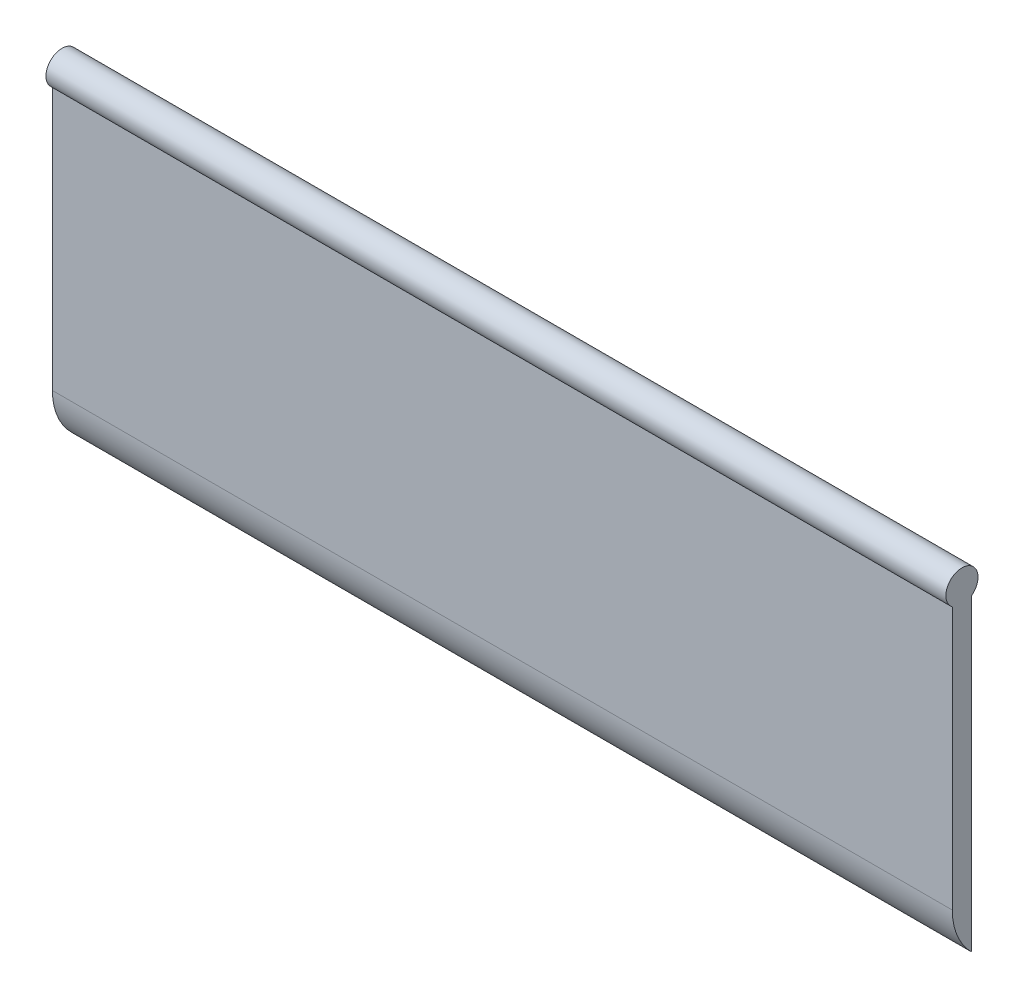
ISO-10303-21;
HEADER;
FILE_DESCRIPTION(('STEP AP214'),'2;1');
FILE_NAME('part.step','',(''),(''),'','','');
FILE_SCHEMA(('AUTOMOTIVE_DESIGN { 1 0 10303 214 1 1 1 1 }'));
ENDSEC;
DATA;
#1=APPLICATION_CONTEXT('core data for automotive mechanical design processes');
#2=APPLICATION_PROTOCOL_DEFINITION('international standard','automotive_design',2000,#1);
#3=PRODUCT_CONTEXT('',#1,'mechanical');
#4=PRODUCT('Part','Part','',(#3));
#5=PRODUCT_RELATED_PRODUCT_CATEGORY('part','',(#4));
#6=PRODUCT_DEFINITION_FORMATION('','',#4);
#7=PRODUCT_DEFINITION_CONTEXT('part definition',#1,'design');
#8=PRODUCT_DEFINITION('design','',#6,#7);
#9=PRODUCT_DEFINITION_SHAPE('','',#8);
#10=(LENGTH_UNIT() NAMED_UNIT(*) SI_UNIT(.MILLI.,.METRE.));
#11=(NAMED_UNIT(*) PLANE_ANGLE_UNIT() SI_UNIT($,.RADIAN.));
#12=(NAMED_UNIT(*) SI_UNIT($,.STERADIAN.) SOLID_ANGLE_UNIT());
#13=UNCERTAINTY_MEASURE_WITH_UNIT(LENGTH_MEASURE(1.E-05),#10,'distance_accuracy_value','');
#14=(GEOMETRIC_REPRESENTATION_CONTEXT(3) GLOBAL_UNCERTAINTY_ASSIGNED_CONTEXT((#13)) GLOBAL_UNIT_ASSIGNED_CONTEXT((#10,
#11,#12)) REPRESENTATION_CONTEXT('',''));
#15=CARTESIAN_POINT('',(0.,0.,0.));
#16=DIRECTION('',(0.,0.,1.));
#17=DIRECTION('',(1.,0.,0.));
#18=AXIS2_PLACEMENT_3D('',#15,#16,#17);
#19=CARTESIAN_POINT('',(140.,50.,-1.5));
#20=DIRECTION('',(-1.,0.,0.));
#21=DIRECTION('',(0.,0.,1.));
#22=AXIS2_PLACEMENT_3D('',#19,#20,#21);
#23=CYLINDRICAL_SURFACE('',#22,2.5);
#24=CARTESIAN_POINT('',(0.,50.,-1.5));
#25=DIRECTION('',(1.,0.,0.));
#26=DIRECTION('',(0.,0.,-1.));
#27=AXIS2_PLACEMENT_3D('',#24,#25,#26);
#28=CIRCLE('',#27,2.5);
#29=CARTESIAN_POINT('',(0.,48.,-3.));
#30=VERTEX_POINT('',#29);
#31=CARTESIAN_POINT('',(0.,48.,0.));
#32=VERTEX_POINT('',#31);
#33=EDGE_CURVE('E107',#30,#32,#28,.T.);
#34=ORIENTED_EDGE('',*,*,#33,.T.);
#35=DIRECTION('',(-1.,0.,0.));
#36=VECTOR('',#35,1.);
#37=CARTESIAN_POINT('',(140.,48.,0.));
#38=LINE('',#37,#36);
#39=CARTESIAN_POINT('',(140.,48.,0.));
#40=VERTEX_POINT('',#39);
#41=EDGE_CURVE('E89',#40,#32,#38,.T.);
#42=ORIENTED_EDGE('',*,*,#41,.F.);
#43=CARTESIAN_POINT('',(140.,50.,-1.5));
#44=DIRECTION('',(1.,0.,0.));
#45=DIRECTION('',(0.,0.,-1.));
#46=AXIS2_PLACEMENT_3D('',#43,#44,#45);
#47=CIRCLE('',#46,2.5);
#48=CARTESIAN_POINT('',(140.,48.,-3.));
#49=VERTEX_POINT('',#48);
#50=EDGE_CURVE('E95',#49,#40,#47,.T.);
#51=ORIENTED_EDGE('',*,*,#50,.F.);
#52=DIRECTION('',(-1.,0.,0.));
#53=VECTOR('',#52,1.);
#54=CARTESIAN_POINT('',(140.,48.,-3.));
#55=LINE('',#54,#53);
#56=EDGE_CURVE('E115',#49,#30,#55,.T.);
#57=ORIENTED_EDGE('',*,*,#56,.T.);
#58=EDGE_LOOP('',(#34,#42,#51,#57));
#59=FACE_BOUND('',#58,.T.);
#60=ADVANCED_FACE('F47',(#59),#23,.T.);
#61=CARTESIAN_POINT('',(140.,0.,0.));
#62=DIRECTION('',(0.,0.,1.));
#63=DIRECTION('',(1.,0.,0.));
#64=AXIS2_PLACEMENT_3D('',#61,#62,#63);
#65=PLANE('',#64);
#66=DIRECTION('',(0.,1.,0.));
#67=VECTOR('',#66,1.);
#68=CARTESIAN_POINT('',(0.,0.,0.));
#69=LINE('',#68,#67);
#70=CARTESIAN_POINT('',(0.,7.14142842854285,0.));
#71=VERTEX_POINT('',#70);
#72=EDGE_CURVE('E123',#71,#32,#69,.T.);
#73=ORIENTED_EDGE('',*,*,#72,.F.);
#74=DIRECTION('',(-1.,0.,0.));
#75=VECTOR('',#74,1.);
#76=CARTESIAN_POINT('',(140.,7.14142842854285,0.));
#77=LINE('',#76,#75);
#78=CARTESIAN_POINT('',(140.,7.14142842854285,0.));
#79=VERTEX_POINT('',#78);
#80=EDGE_CURVE('E56',#71,#79,#77,.F.);
#81=ORIENTED_EDGE('',*,*,#80,.T.);
#82=DIRECTION('',(0.,1.,0.));
#83=VECTOR('',#82,1.);
#84=CARTESIAN_POINT('',(140.,0.,0.));
#85=LINE('',#84,#83);
#86=EDGE_CURVE('E85',#79,#40,#85,.T.);
#87=ORIENTED_EDGE('',*,*,#86,.T.);
#88=ORIENTED_EDGE('',*,*,#41,.T.);
#89=EDGE_LOOP('',(#73,#81,#87,#88));
#90=FACE_BOUND('',#89,.T.);
#91=ADVANCED_FACE('F87',(#90),#65,.T.);
#92=CARTESIAN_POINT('',(140.,0.,-3.));
#93=DIRECTION('',(0.,0.,1.));
#94=DIRECTION('',(1.,0.,0.));
#95=AXIS2_PLACEMENT_3D('',#92,#93,#94);
#96=PLANE('',#95);
#97=DIRECTION('',(0.,1.,0.));
#98=VECTOR('',#97,1.);
#99=CARTESIAN_POINT('',(0.,0.,-3.));
#100=LINE('',#99,#98);
#101=CARTESIAN_POINT('',(0.,0.,-3.));
#102=VERTEX_POINT('',#101);
#103=EDGE_CURVE('E104',#102,#30,#100,.T.);
#104=ORIENTED_EDGE('',*,*,#103,.T.);
#105=ORIENTED_EDGE('',*,*,#56,.F.);
#106=DIRECTION('',(0.,1.,0.));
#107=VECTOR('',#106,1.);
#108=CARTESIAN_POINT('',(140.,0.,-3.));
#109=LINE('',#108,#107);
#110=CARTESIAN_POINT('',(140.,0.,-3.));
#111=VERTEX_POINT('',#110);
#112=EDGE_CURVE('E94',#111,#49,#109,.T.);
#113=ORIENTED_EDGE('',*,*,#112,.F.);
#114=DIRECTION('',(-1.,0.,0.));
#115=VECTOR('',#114,1.);
#116=CARTESIAN_POINT('',(140.,0.,-3.));
#117=LINE('',#116,#115);
#118=EDGE_CURVE('E109',#111,#102,#117,.T.);
#119=ORIENTED_EDGE('',*,*,#118,.T.);
#120=EDGE_LOOP('',(#104,#105,#113,#119));
#121=FACE_BOUND('',#120,.T.);
#122=ADVANCED_FACE('F133',(#121),#96,.F.);
#123=CARTESIAN_POINT('',(140.,0.,0.));
#124=DIRECTION('',(1.,0.,0.));
#125=DIRECTION('',(0.,0.,-1.));
#126=AXIS2_PLACEMENT_3D('',#123,#124,#125);
#127=PLANE('',#126);
#128=ORIENTED_EDGE('',*,*,#86,.F.);
#129=CARTESIAN_POINT('',(140.,7.14142842854285,-10.));
#130=DIRECTION('',(1.,0.,0.));
#131=DIRECTION('',(0.,0.,-1.));
#132=AXIS2_PLACEMENT_3D('',#129,#130,#131);
#133=CIRCLE('',#132,10.);
#134=EDGE_CURVE('E11',#79,#111,#133,.T.);
#135=ORIENTED_EDGE('',*,*,#134,.T.);
#136=ORIENTED_EDGE('',*,*,#112,.T.);
#137=ORIENTED_EDGE('',*,*,#50,.T.);
#138=EDGE_LOOP('',(#128,#135,#136,#137));
#139=FACE_BOUND('',#138,.T.);
#140=ADVANCED_FACE('F98',(#139),#127,.T.);
#141=CARTESIAN_POINT('',(0.,0.,0.));
#142=DIRECTION('',(1.,0.,0.));
#143=DIRECTION('',(0.,0.,-1.));
#144=AXIS2_PLACEMENT_3D('',#141,#142,#143);
#145=PLANE('',#144);
#146=ORIENTED_EDGE('',*,*,#103,.F.);
#147=CARTESIAN_POINT('',(0.,7.14142842854285,-10.));
#148=DIRECTION('',(1.,0.,0.));
#149=DIRECTION('',(0.,0.,-1.));
#150=AXIS2_PLACEMENT_3D('',#147,#148,#149);
#151=CIRCLE('',#150,10.);
#152=EDGE_CURVE('E70',#102,#71,#151,.F.);
#153=ORIENTED_EDGE('',*,*,#152,.T.);
#154=ORIENTED_EDGE('',*,*,#72,.T.);
#155=ORIENTED_EDGE('',*,*,#33,.F.);
#156=EDGE_LOOP('',(#146,#153,#154,#155));
#157=FACE_BOUND('',#156,.T.);
#158=ADVANCED_FACE('F129',(#157),#145,.F.);
#159=CARTESIAN_POINT('',(140.,7.14142842854285,-10.));
#160=DIRECTION('',(1.,0.,0.));
#161=DIRECTION('',(0.,0.,-1.));
#162=AXIS2_PLACEMENT_3D('',#159,#160,#161);
#163=CYLINDRICAL_SURFACE('',#162,10.);
#164=ORIENTED_EDGE('',*,*,#134,.F.);
#165=ORIENTED_EDGE('',*,*,#80,.F.);
#166=ORIENTED_EDGE('',*,*,#152,.F.);
#167=ORIENTED_EDGE('',*,*,#118,.F.);
#168=EDGE_LOOP('',(#164,#165,#166,#167));
#169=FACE_BOUND('',#168,.T.);
#170=ADVANCED_FACE('F49',(#169),#163,.T.);
#171=CLOSED_SHELL('',(#60,#91,#122,#140,#158,#170));
#172=MANIFOLD_SOLID_BREP('B2',#171);
#173=ADVANCED_BREP_SHAPE_REPRESENTATION('',(#18,#172),#14);
#174=SHAPE_DEFINITION_REPRESENTATION(#9,#173);
ENDSEC;
END-ISO-10303-21;
